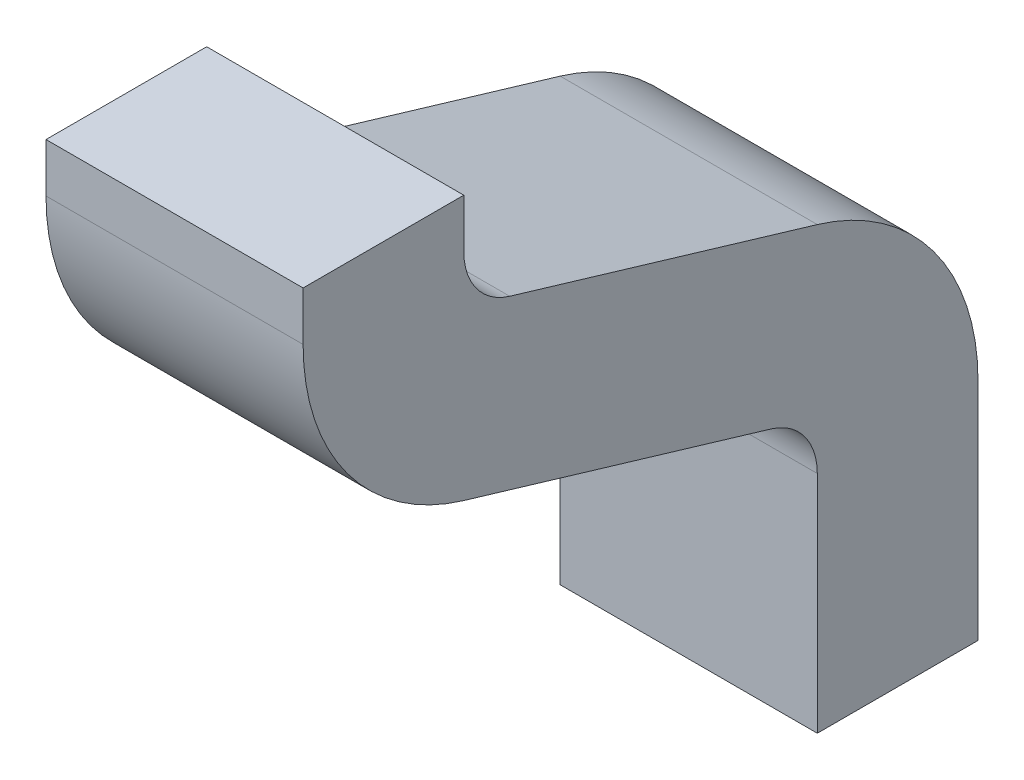
ISO-10303-21;
HEADER;
FILE_DESCRIPTION(('STEP AP214'),'2;1');
FILE_NAME('part.step','',(''),(''),'','','');
FILE_SCHEMA(('AUTOMOTIVE_DESIGN { 1 0 10303 214 1 1 1 1 }'));
ENDSEC;
DATA;
#1=APPLICATION_CONTEXT('core data for automotive mechanical design processes');
#2=APPLICATION_PROTOCOL_DEFINITION('international standard','automotive_design',2000,#1);
#3=PRODUCT_CONTEXT('',#1,'mechanical');
#4=PRODUCT('Part','Part','',(#3));
#5=PRODUCT_RELATED_PRODUCT_CATEGORY('part','',(#4));
#6=PRODUCT_DEFINITION_FORMATION('','',#4);
#7=PRODUCT_DEFINITION_CONTEXT('part definition',#1,'design');
#8=PRODUCT_DEFINITION('design','',#6,#7);
#9=PRODUCT_DEFINITION_SHAPE('','',#8);
#10=(LENGTH_UNIT() NAMED_UNIT(*) SI_UNIT(.MILLI.,.METRE.));
#11=(NAMED_UNIT(*) PLANE_ANGLE_UNIT() SI_UNIT($,.RADIAN.));
#12=(NAMED_UNIT(*) SI_UNIT($,.STERADIAN.) SOLID_ANGLE_UNIT());
#13=UNCERTAINTY_MEASURE_WITH_UNIT(LENGTH_MEASURE(1.E-05),#10,'distance_accuracy_value','');
#14=(GEOMETRIC_REPRESENTATION_CONTEXT(3) GLOBAL_UNCERTAINTY_ASSIGNED_CONTEXT((#13)) GLOBAL_UNIT_ASSIGNED_CONTEXT((#10,
#11,#12)) REPRESENTATION_CONTEXT('',''));
#15=CARTESIAN_POINT('',(0.,0.,0.));
#16=DIRECTION('',(0.,0.,1.));
#17=DIRECTION('',(1.,0.,0.));
#18=AXIS2_PLACEMENT_3D('',#15,#16,#17);
#19=CARTESIAN_POINT('',(0.435,-2.94999997764826,0.));
#20=DIRECTION('',(0.,-1.,0.));
#21=DIRECTION('',(0.,0.,-1.));
#22=AXIS2_PLACEMENT_3D('',#19,#20,#21);
#23=PLANE('',#22);
#24=DIRECTION('',(-1.,0.,0.));
#25=VECTOR('',#24,1.);
#26=CARTESIAN_POINT('',(0.635,-2.94999997764826,0.25));
#27=LINE('',#26,#25);
#28=CARTESIAN_POINT('',(0.835,-2.94999997764826,0.25));
#29=VERTEX_POINT('',#28);
#30=CARTESIAN_POINT('',(0.435,-2.94999997764826,0.25));
#31=VERTEX_POINT('',#30);
#32=EDGE_CURVE('E182',#29,#31,#27,.T.);
#33=ORIENTED_EDGE('',*,*,#32,.T.);
#34=DIRECTION('',(0.,0.,1.));
#35=VECTOR('',#34,1.);
#36=CARTESIAN_POINT('',(0.435,-2.94999997764826,0.));
#37=LINE('',#36,#35);
#38=CARTESIAN_POINT('',(0.435,-2.94999997764826,0.));
#39=VERTEX_POINT('',#38);
#40=EDGE_CURVE('E186',#39,#31,#37,.T.);
#41=ORIENTED_EDGE('',*,*,#40,.F.);
#42=DIRECTION('',(-1.,0.,0.));
#43=VECTOR('',#42,1.);
#44=CARTESIAN_POINT('',(0.835,-2.94999997764826,0.));
#45=LINE('',#44,#43);
#46=CARTESIAN_POINT('',(0.835,-2.94999997764826,0.));
#47=VERTEX_POINT('',#46);
#48=EDGE_CURVE('E170',#47,#39,#45,.T.);
#49=ORIENTED_EDGE('',*,*,#48,.F.);
#50=DIRECTION('',(0.,0.,1.));
#51=VECTOR('',#50,1.);
#52=CARTESIAN_POINT('',(0.835,-2.94999997764826,0.));
#53=LINE('',#52,#51);
#54=EDGE_CURVE('E217',#47,#29,#53,.T.);
#55=ORIENTED_EDGE('',*,*,#54,.T.);
#56=EDGE_LOOP('',(#33,#41,#49,#55));
#57=FACE_BOUND('',#56,.T.);
#58=ADVANCED_FACE('F16',(#57),#23,.T.);
#59=CARTESIAN_POINT('',(0.835,-1.95,0.));
#60=DIRECTION('',(0.,1.,0.));
#61=DIRECTION('',(1.,0.,0.));
#62=AXIS2_PLACEMENT_3D('',#59,#60,#61);
#63=PLANE('',#62);
#64=DIRECTION('',(-1.,0.,0.));
#65=VECTOR('',#64,1.);
#66=CARTESIAN_POINT('',(0.835,-1.95,0.8));
#67=LINE('',#66,#65);
#68=CARTESIAN_POINT('',(0.835,-1.95,0.8));
#69=VERTEX_POINT('',#68);
#70=CARTESIAN_POINT('',(0.435,-1.95,0.8));
#71=VERTEX_POINT('',#70);
#72=EDGE_CURVE('E143',#69,#71,#67,.T.);
#73=ORIENTED_EDGE('',*,*,#72,.T.);
#74=DIRECTION('',(0.,0.,1.));
#75=VECTOR('',#74,1.);
#76=CARTESIAN_POINT('',(0.435,-1.95,0.));
#77=LINE('',#76,#75);
#78=CARTESIAN_POINT('',(0.435,-1.95,1.05));
#79=VERTEX_POINT('',#78);
#80=EDGE_CURVE('E27',#71,#79,#77,.T.);
#81=ORIENTED_EDGE('',*,*,#80,.T.);
#82=DIRECTION('',(-1.,0.,0.));
#83=VECTOR('',#82,1.);
#84=CARTESIAN_POINT('',(0.435,-1.95,1.05));
#85=LINE('',#84,#83);
#86=CARTESIAN_POINT('',(0.835,-1.95,1.05));
#87=VERTEX_POINT('',#86);
#88=EDGE_CURVE('E11',#87,#79,#85,.T.);
#89=ORIENTED_EDGE('',*,*,#88,.F.);
#90=DIRECTION('',(0.,0.,1.));
#91=VECTOR('',#90,1.);
#92=CARTESIAN_POINT('',(0.835,-1.95,0.));
#93=LINE('',#92,#91);
#94=EDGE_CURVE('E200',#69,#87,#93,.T.);
#95=ORIENTED_EDGE('',*,*,#94,.F.);
#96=EDGE_LOOP('',(#73,#81,#89,#95));
#97=FACE_BOUND('',#96,.T.);
#98=ADVANCED_FACE('F299',(#97),#63,.T.);
#99=CARTESIAN_POINT('',(0.635,-2.44999998882413,1.05));
#100=DIRECTION('',(0.,0.,1.));
#101=DIRECTION('',(1.,0.,0.));
#102=AXIS2_PLACEMENT_3D('',#99,#100,#101);
#103=PLANE('',#102);
#104=DIRECTION('',(1.,0.,0.));
#105=VECTOR('',#104,1.);
#106=CARTESIAN_POINT('',(0.835,-2.02607597029658,1.05));
#107=LINE('',#106,#105);
#108=CARTESIAN_POINT('',(0.435,-2.02607597029658,1.04999999259368));
#109=VERTEX_POINT('',#108);
#110=CARTESIAN_POINT('',(0.835,-2.02607597029658,1.04999999259368));
#111=VERTEX_POINT('',#110);
#112=EDGE_CURVE('E214',#109,#111,#107,.T.);
#113=ORIENTED_EDGE('',*,*,#112,.T.);
#114=DIRECTION('',(0.,1.,0.));
#115=VECTOR('',#114,1.);
#116=CARTESIAN_POINT('',(0.835,-1.95,1.05));
#117=LINE('',#116,#115);
#118=EDGE_CURVE('E202',#111,#87,#117,.T.);
#119=ORIENTED_EDGE('',*,*,#118,.T.);
#120=ORIENTED_EDGE('',*,*,#88,.T.);
#121=DIRECTION('',(0.,-1.,0.));
#122=VECTOR('',#121,1.);
#123=CARTESIAN_POINT('',(0.435,-2.94999997764826,1.05));
#124=LINE('',#123,#122);
#125=EDGE_CURVE('E195',#79,#109,#124,.T.);
#126=ORIENTED_EDGE('',*,*,#125,.T.);
#127=EDGE_LOOP('',(#113,#119,#120,#126));
#128=FACE_BOUND('',#127,.T.);
#129=ADVANCED_FACE('F302',(#128),#103,.T.);
#130=CARTESIAN_POINT('',(0.435,-1.95,0.));
#131=DIRECTION('',(-1.,0.,0.));
#132=DIRECTION('',(0.,0.,1.));
#133=AXIS2_PLACEMENT_3D('',#130,#131,#132);
#134=PLANE('',#133);
#135=CARTESIAN_POINT('',(0.435,-2.60000012349337,0.350000016624108));
#136=DIRECTION('',(-1.,0.,0.));
#137=DIRECTION('',(0.,0.,-1.));
#138=AXIS2_PLACEMENT_3D('',#135,#136,#137);
#139=CIRCLE('',#138,0.350000016624108);
#140=CARTESIAN_POINT('',(0.435,-2.26458991447753,0.25));
#141=VERTEX_POINT('',#140);
#142=CARTESIAN_POINT('',(0.435,-2.60000012349337,0.));
#143=VERTEX_POINT('',#142);
#144=EDGE_CURVE('E161',#141,#143,#139,.T.);
#145=ORIENTED_EDGE('',*,*,#144,.T.);
#146=DIRECTION('',(0.,1.,0.));
#147=VECTOR('',#146,1.);
#148=CARTESIAN_POINT('',(0.435,-2.94999997764826,0.));
#149=LINE('',#148,#147);
#150=EDGE_CURVE('E203',#39,#143,#149,.T.);
#151=ORIENTED_EDGE('',*,*,#150,.F.);
#152=ORIENTED_EDGE('',*,*,#40,.T.);
#153=DIRECTION('',(0.,1.,0.));
#154=VECTOR('',#153,1.);
#155=CARTESIAN_POINT('',(0.435,-2.27500006174669,0.25));
#156=LINE('',#155,#154);
#157=CARTESIAN_POINT('',(0.435,-2.60000012349337,0.25));
#158=VERTEX_POINT('',#157);
#159=EDGE_CURVE('E175',#31,#158,#156,.T.);
#160=ORIENTED_EDGE('',*,*,#159,.T.);
#161=CARTESIAN_POINT('',(0.435,-2.60000012349337,0.350000016624108));
#162=DIRECTION('',(1.,0.,0.));
#163=DIRECTION('',(0.,0.,-1.));
#164=AXIS2_PLACEMENT_3D('',#161,#162,#163);
#165=CIRCLE('',#164,0.100000016624108);
#166=CARTESIAN_POINT('',(0.435,-2.50416862382375,0.321428579910259));
#167=VERTEX_POINT('',#166);
#168=EDGE_CURVE('E181',#158,#167,#165,.T.);
#169=ORIENTED_EDGE('',*,*,#168,.T.);
#170=DIRECTION('',(0.,0.285714342591025,0.958314830542541));
#171=VECTOR('',#170,1.);
#172=CARTESIAN_POINT('',(0.435,-2.45421141542396,0.488990114511108));
#173=LINE('',#172,#171);
#174=CARTESIAN_POINT('',(0.435,-2.36148395535343,0.800007403241802));
#175=VERTEX_POINT('',#174);
#176=EDGE_CURVE('E183',#167,#175,#173,.T.);
#177=ORIENTED_EDGE('',*,*,#176,.T.);
#178=CARTESIAN_POINT('',(0.435,-2.02607597029658,0.699999985716384));
#179=DIRECTION('',(-1.,0.,0.));
#180=DIRECTION('',(0.,0.,1.));
#181=AXIS2_PLACEMENT_3D('',#178,#179,#180);
#182=CIRCLE('',#181,0.35);
#183=EDGE_CURVE('E210',#175,#109,#182,.T.);
#184=ORIENTED_EDGE('',*,*,#183,.T.);
#185=ORIENTED_EDGE('',*,*,#125,.F.);
#186=ORIENTED_EDGE('',*,*,#80,.F.);
#187=DIRECTION('',(0.,-1.,0.));
#188=VECTOR('',#187,1.);
#189=CARTESIAN_POINT('',(0.435,-1.98803798514829,0.8));
#190=LINE('',#189,#188);
#191=CARTESIAN_POINT('',(0.435,-2.02607597029658,0.8));
#192=VERTEX_POINT('',#191);
#193=EDGE_CURVE('E20',#71,#192,#190,.T.);
#194=ORIENTED_EDGE('',*,*,#193,.T.);
#195=CARTESIAN_POINT('',(0.435,-2.02607597029658,0.699999985716384));
#196=DIRECTION('',(1.,0.,0.));
#197=DIRECTION('',(0.,0.,1.));
#198=AXIS2_PLACEMENT_3D('',#195,#196,#197);
#199=CIRCLE('',#198,0.100000014283616);
#200=CARTESIAN_POINT('',(0.435,-2.12191373715539,0.72855038501725));
#201=VERTEX_POINT('',#200);
#202=EDGE_CURVE('E80',#192,#201,#199,.T.);
#203=ORIENTED_EDGE('',*,*,#202,.T.);
#204=DIRECTION('',(0.,-0.285714319641041,-0.958314837384905));
#205=VECTOR('',#204,1.);
#206=CARTESIAN_POINT('',(0.435,-2.28597504072621,0.178272115275113));
#207=LINE('',#206,#205);
#208=EDGE_CURVE('E187',#201,#141,#207,.T.);
#209=ORIENTED_EDGE('',*,*,#208,.T.);
#210=EDGE_LOOP('',(#145,#151,#152,#160,#169,#177,#184,#185,#186,#194,#203,#209));
#211=FACE_BOUND('',#210,.T.);
#212=ADVANCED_FACE('F286',(#211),#134,.T.);
#213=CARTESIAN_POINT('',(0.835,-2.36148395535343,0.800007403241802));
#214=DIRECTION('',(0.,0.958314830542541,-0.285714342591025));
#215=DIRECTION('',(-1.,0.,0.));
#216=AXIS2_PLACEMENT_3D('',#213,#214,#215);
#217=PLANE('',#216);
#218=DIRECTION('',(0.,-0.285714342591025,-0.958314830542541));
#219=VECTOR('',#218,1.);
#220=CARTESIAN_POINT('',(0.835,-2.49502775729276,0.352087971669264));
#221=LINE('',#220,#219);
#222=CARTESIAN_POINT('',(0.835,-2.36148395535343,0.800007403241802));
#223=VERTEX_POINT('',#222);
#224=CARTESIAN_POINT('',(0.835,-2.50416862382375,0.321428579910259));
#225=VERTEX_POINT('',#224);
#226=EDGE_CURVE('E231',#223,#225,#221,.T.);
#227=ORIENTED_EDGE('',*,*,#226,.F.);
#228=DIRECTION('',(-1.,0.,0.));
#229=VECTOR('',#228,1.);
#230=CARTESIAN_POINT('',(0.835,-2.36148395535343,0.800007403241802));
#231=LINE('',#230,#229);
#232=EDGE_CURVE('E176',#223,#175,#231,.T.);
#233=ORIENTED_EDGE('',*,*,#232,.T.);
#234=ORIENTED_EDGE('',*,*,#176,.F.);
#235=DIRECTION('',(-1.,0.,0.));
#236=VECTOR('',#235,1.);
#237=CARTESIAN_POINT('',(0.835,-2.50416862382375,0.321428579910259));
#238=LINE('',#237,#236);
#239=EDGE_CURVE('E177',#225,#167,#238,.T.);
#240=ORIENTED_EDGE('',*,*,#239,.F.);
#241=EDGE_LOOP('',(#227,#233,#234,#240));
#242=FACE_BOUND('',#241,.T.);
#243=ADVANCED_FACE('F309',(#242),#217,.F.);
#244=CARTESIAN_POINT('',(0.835,-2.60000012349337,0.350000016624108));
#245=DIRECTION('',(-1.,0.,0.));
#246=DIRECTION('',(0.,0.,-1.));
#247=AXIS2_PLACEMENT_3D('',#244,#245,#246);
#248=CYLINDRICAL_SURFACE('',#247,0.100000016624108);
#249=CARTESIAN_POINT('',(0.835,-2.60000012349337,0.350000016624108));
#250=DIRECTION('',(-1.,0.,0.));
#251=DIRECTION('',(0.,0.,-1.));
#252=AXIS2_PLACEMENT_3D('',#249,#250,#251);
#253=CIRCLE('',#252,0.100000016624108);
#254=CARTESIAN_POINT('',(0.835,-2.60000012349337,0.25));
#255=VERTEX_POINT('',#254);
#256=EDGE_CURVE('E226',#225,#255,#253,.T.);
#257=ORIENTED_EDGE('',*,*,#256,.F.);
#258=ORIENTED_EDGE('',*,*,#239,.T.);
#259=ORIENTED_EDGE('',*,*,#168,.F.);
#260=DIRECTION('',(-1.,0.,0.));
#261=VECTOR('',#260,1.);
#262=CARTESIAN_POINT('',(0.835,-2.60000012349337,0.25));
#263=LINE('',#262,#261);
#264=EDGE_CURVE('E171',#255,#158,#263,.T.);
#265=ORIENTED_EDGE('',*,*,#264,.F.);
#266=EDGE_LOOP('',(#257,#258,#259,#265));
#267=FACE_BOUND('',#266,.T.);
#268=ADVANCED_FACE('F269',(#267),#248,.F.);
#269=CARTESIAN_POINT('',(0.835,-2.60000012349337,0.25));
#270=DIRECTION('',(0.,0.,-1.));
#271=DIRECTION('',(0.,-1.,0.));
#272=AXIS2_PLACEMENT_3D('',#269,#270,#271);
#273=PLANE('',#272);
#274=DIRECTION('',(0.,-1.,0.));
#275=VECTOR('',#274,1.);
#276=CARTESIAN_POINT('',(0.835,-2.77500005057082,0.25));
#277=LINE('',#276,#275);
#278=EDGE_CURVE('E222',#255,#29,#277,.T.);
#279=ORIENTED_EDGE('',*,*,#278,.F.);
#280=ORIENTED_EDGE('',*,*,#264,.T.);
#281=ORIENTED_EDGE('',*,*,#159,.F.);
#282=ORIENTED_EDGE('',*,*,#32,.F.);
#283=EDGE_LOOP('',(#279,#280,#281,#282));
#284=FACE_BOUND('',#283,.T.);
#285=ADVANCED_FACE('F273',(#284),#273,.F.);
#286=CARTESIAN_POINT('',(0.835,-2.02607597029658,0.699999985716384));
#287=DIRECTION('',(-1.,0.,0.));
#288=DIRECTION('',(0.,0.,1.));
#289=AXIS2_PLACEMENT_3D('',#286,#287,#288);
#290=CYLINDRICAL_SURFACE('',#289,0.35);
#291=CARTESIAN_POINT('',(0.835,-2.02607597029658,0.699999985716384));
#292=DIRECTION('',(1.,0.,0.));
#293=DIRECTION('',(0.,0.,1.));
#294=AXIS2_PLACEMENT_3D('',#291,#292,#293);
#295=CIRCLE('',#294,0.35);
#296=EDGE_CURVE('E227',#111,#223,#295,.T.);
#297=ORIENTED_EDGE('',*,*,#296,.F.);
#298=ORIENTED_EDGE('',*,*,#112,.F.);
#299=ORIENTED_EDGE('',*,*,#183,.F.);
#300=ORIENTED_EDGE('',*,*,#232,.F.);
#301=EDGE_LOOP('',(#297,#298,#299,#300));
#302=FACE_BOUND('',#301,.T.);
#303=ADVANCED_FACE('F307',(#302),#290,.T.);
#304=CARTESIAN_POINT('',(0.835,-2.94999997764826,0.));
#305=DIRECTION('',(1.,0.,0.));
#306=DIRECTION('',(0.,1.,0.));
#307=AXIS2_PLACEMENT_3D('',#304,#305,#306);
#308=PLANE('',#307);
#309=CARTESIAN_POINT('',(0.835,-2.60000012349337,0.350000016624108));
#310=DIRECTION('',(1.,0.,0.));
#311=DIRECTION('',(0.,0.,-1.));
#312=AXIS2_PLACEMENT_3D('',#309,#310,#311);
#313=CIRCLE('',#312,0.350000016624108);
#314=CARTESIAN_POINT('',(0.835,-2.60000012349337,0.));
#315=VERTEX_POINT('',#314);
#316=CARTESIAN_POINT('',(0.835,-2.26458991447753,0.25));
#317=VERTEX_POINT('',#316);
#318=EDGE_CURVE('E191',#315,#317,#313,.T.);
#319=ORIENTED_EDGE('',*,*,#318,.T.);
#320=DIRECTION('',(0.,0.285714319641041,0.958314837384905));
#321=VECTOR('',#320,1.);
#322=CARTESIAN_POINT('',(0.835,-2.32679137603786,0.041369982452443));
#323=LINE('',#322,#321);
#324=CARTESIAN_POINT('',(0.835,-2.12191373715539,0.72855038501725));
#325=VERTEX_POINT('',#324);
#326=EDGE_CURVE('E139',#317,#325,#323,.T.);
#327=ORIENTED_EDGE('',*,*,#326,.T.);
#328=CARTESIAN_POINT('',(0.835,-2.02607597029658,0.699999985716384));
#329=DIRECTION('',(-1.,0.,0.));
#330=DIRECTION('',(0.,0.,1.));
#331=AXIS2_PLACEMENT_3D('',#328,#329,#330);
#332=CIRCLE('',#331,0.100000014283616);
#333=CARTESIAN_POINT('',(0.835,-2.02607597029658,0.8));
#334=VERTEX_POINT('',#333);
#335=EDGE_CURVE('E133',#325,#334,#332,.T.);
#336=ORIENTED_EDGE('',*,*,#335,.T.);
#337=DIRECTION('',(0.,1.,0.));
#338=VECTOR('',#337,1.);
#339=CARTESIAN_POINT('',(0.835,-2.48803797397242,0.8));
#340=LINE('',#339,#338);
#341=EDGE_CURVE('E137',#334,#69,#340,.T.);
#342=ORIENTED_EDGE('',*,*,#341,.T.);
#343=ORIENTED_EDGE('',*,*,#94,.T.);
#344=ORIENTED_EDGE('',*,*,#118,.F.);
#345=ORIENTED_EDGE('',*,*,#296,.T.);
#346=ORIENTED_EDGE('',*,*,#226,.T.);
#347=ORIENTED_EDGE('',*,*,#256,.T.);
#348=ORIENTED_EDGE('',*,*,#278,.T.);
#349=ORIENTED_EDGE('',*,*,#54,.F.);
#350=DIRECTION('',(0.,-1.,0.));
#351=VECTOR('',#350,1.);
#352=CARTESIAN_POINT('',(0.835,-1.95,0.));
#353=LINE('',#352,#351);
#354=EDGE_CURVE('E165',#315,#47,#353,.T.);
#355=ORIENTED_EDGE('',*,*,#354,.F.);
#356=EDGE_LOOP('',(#319,#327,#336,#342,#343,#344,#345,#346,#347,#348,#349,#355));
#357=FACE_BOUND('',#356,.T.);
#358=ADVANCED_FACE('F134',(#357),#308,.T.);
#359=CARTESIAN_POINT('',(0.635,-2.44999998882413,0.));
#360=DIRECTION('',(0.,0.,1.));
#361=DIRECTION('',(1.,0.,0.));
#362=AXIS2_PLACEMENT_3D('',#359,#360,#361);
#363=PLANE('',#362);
#364=DIRECTION('',(1.,0.,0.));
#365=VECTOR('',#364,1.);
#366=CARTESIAN_POINT('',(0.835,-2.60000012349337,0.));
#367=LINE('',#366,#365);
#368=EDGE_CURVE('E166',#143,#315,#367,.T.);
#369=ORIENTED_EDGE('',*,*,#368,.T.);
#370=ORIENTED_EDGE('',*,*,#354,.T.);
#371=ORIENTED_EDGE('',*,*,#48,.T.);
#372=ORIENTED_EDGE('',*,*,#150,.T.);
#373=EDGE_LOOP('',(#369,#370,#371,#372));
#374=FACE_BOUND('',#373,.T.);
#375=ADVANCED_FACE('F283',(#374),#363,.F.);
#376=CARTESIAN_POINT('',(0.835,-2.60000012349337,0.350000016624108));
#377=DIRECTION('',(-1.,0.,0.));
#378=DIRECTION('',(0.,0.,-1.));
#379=AXIS2_PLACEMENT_3D('',#376,#377,#378);
#380=CYLINDRICAL_SURFACE('',#379,0.350000016624108);
#381=ORIENTED_EDGE('',*,*,#318,.F.);
#382=ORIENTED_EDGE('',*,*,#368,.F.);
#383=ORIENTED_EDGE('',*,*,#144,.F.);
#384=DIRECTION('',(-1.,0.,0.));
#385=VECTOR('',#384,1.);
#386=CARTESIAN_POINT('',(0.835,-2.26458991447753,0.25));
#387=LINE('',#386,#385);
#388=EDGE_CURVE('E192',#317,#141,#387,.T.);
#389=ORIENTED_EDGE('',*,*,#388,.F.);
#390=EDGE_LOOP('',(#381,#382,#383,#389));
#391=FACE_BOUND('',#390,.T.);
#392=ADVANCED_FACE('F289',(#391),#380,.T.);
#393=CARTESIAN_POINT('',(0.835,-2.26458991447753,0.25));
#394=DIRECTION('',(0.,-0.958314837384905,0.285714319641041));
#395=DIRECTION('',(-1.,0.,0.));
#396=AXIS2_PLACEMENT_3D('',#393,#394,#395);
#397=PLANE('',#396);
#398=ORIENTED_EDGE('',*,*,#326,.F.);
#399=ORIENTED_EDGE('',*,*,#388,.T.);
#400=ORIENTED_EDGE('',*,*,#208,.F.);
#401=DIRECTION('',(-1.,0.,0.));
#402=VECTOR('',#401,1.);
#403=CARTESIAN_POINT('',(0.835,-2.12191373715539,0.72855038501725));
#404=LINE('',#403,#402);
#405=EDGE_CURVE('E142',#325,#201,#404,.T.);
#406=ORIENTED_EDGE('',*,*,#405,.F.);
#407=EDGE_LOOP('',(#398,#399,#400,#406));
#408=FACE_BOUND('',#407,.T.);
#409=ADVANCED_FACE('F291',(#408),#397,.F.);
#410=CARTESIAN_POINT('',(0.835,-2.02607597029658,0.699999985716384));
#411=DIRECTION('',(-1.,0.,0.));
#412=DIRECTION('',(0.,0.,1.));
#413=AXIS2_PLACEMENT_3D('',#410,#411,#412);
#414=CYLINDRICAL_SURFACE('',#413,0.100000014283616);
#415=ORIENTED_EDGE('',*,*,#335,.F.);
#416=ORIENTED_EDGE('',*,*,#405,.T.);
#417=ORIENTED_EDGE('',*,*,#202,.F.);
#418=DIRECTION('',(-1.,0.,0.));
#419=VECTOR('',#418,1.);
#420=CARTESIAN_POINT('',(0.835,-2.02607597029658,0.8));
#421=LINE('',#420,#419);
#422=EDGE_CURVE('E146',#334,#192,#421,.T.);
#423=ORIENTED_EDGE('',*,*,#422,.F.);
#424=EDGE_LOOP('',(#415,#416,#417,#423));
#425=FACE_BOUND('',#424,.T.);
#426=ADVANCED_FACE('F18',(#425),#414,.F.);
#427=CARTESIAN_POINT('',(0.835,-2.02607597029658,0.8));
#428=DIRECTION('',(0.,0.,1.));
#429=DIRECTION('',(1.,0.,0.));
#430=AXIS2_PLACEMENT_3D('',#427,#428,#429);
#431=PLANE('',#430);
#432=ORIENTED_EDGE('',*,*,#341,.F.);
#433=ORIENTED_EDGE('',*,*,#422,.T.);
#434=ORIENTED_EDGE('',*,*,#193,.F.);
#435=ORIENTED_EDGE('',*,*,#72,.F.);
#436=EDGE_LOOP('',(#432,#433,#434,#435));
#437=FACE_BOUND('',#436,.T.);
#438=ADVANCED_FACE('F152',(#437),#431,.F.);
#439=CLOSED_SHELL('',(#58,#98,#129,#212,#243,#268,#285,#303,#358,#375,#392,#409,#426,#438));
#440=MANIFOLD_SOLID_BREP('B1',#439);
#441=ADVANCED_BREP_SHAPE_REPRESENTATION('',(#18,#440),#14);
#442=SHAPE_DEFINITION_REPRESENTATION(#9,#441);
ENDSEC;
END-ISO-10303-21;
